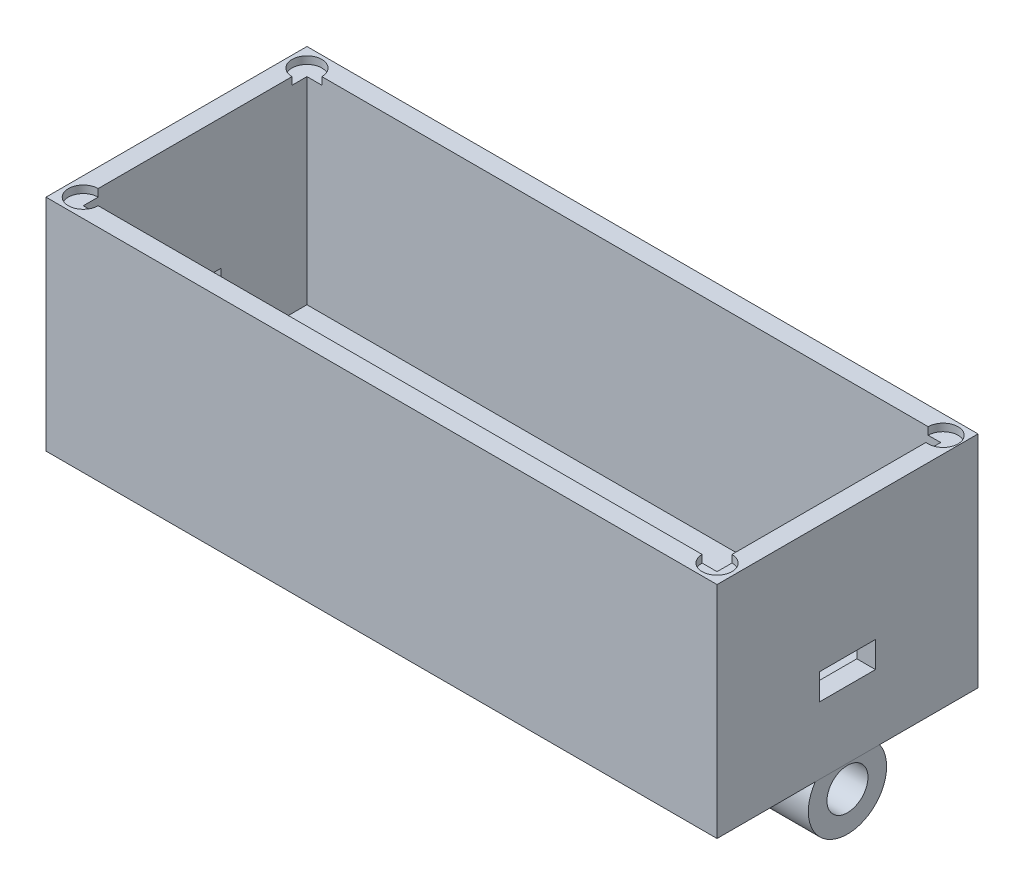
ISO-10303-21;
HEADER;
FILE_DESCRIPTION(('STEP AP214'),'2;1');
FILE_NAME('part.step','',(''),(''),'','','');
FILE_SCHEMA(('AUTOMOTIVE_DESIGN { 1 0 10303 214 1 1 1 1 }'));
ENDSEC;
DATA;
#1=APPLICATION_CONTEXT('core data for automotive mechanical design processes');
#2=APPLICATION_PROTOCOL_DEFINITION('international standard','automotive_design',2000,#1);
#3=PRODUCT_CONTEXT('',#1,'mechanical');
#4=PRODUCT('Part','Part','',(#3));
#5=PRODUCT_RELATED_PRODUCT_CATEGORY('part','',(#4));
#6=PRODUCT_DEFINITION_FORMATION('','',#4);
#7=PRODUCT_DEFINITION_CONTEXT('part definition',#1,'design');
#8=PRODUCT_DEFINITION('design','',#6,#7);
#9=PRODUCT_DEFINITION_SHAPE('','',#8);
#10=(LENGTH_UNIT() NAMED_UNIT(*) SI_UNIT(.MILLI.,.METRE.));
#11=(NAMED_UNIT(*) PLANE_ANGLE_UNIT() SI_UNIT($,.RADIAN.));
#12=(NAMED_UNIT(*) SI_UNIT($,.STERADIAN.) SOLID_ANGLE_UNIT());
#13=UNCERTAINTY_MEASURE_WITH_UNIT(LENGTH_MEASURE(1.E-05),#10,'distance_accuracy_value','');
#14=(GEOMETRIC_REPRESENTATION_CONTEXT(3) GLOBAL_UNCERTAINTY_ASSIGNED_CONTEXT((#13)) GLOBAL_UNIT_ASSIGNED_CONTEXT((#10,
#11,#12)) REPRESENTATION_CONTEXT('',''));
#15=CARTESIAN_POINT('',(0.,0.,0.));
#16=DIRECTION('',(0.,0.,1.));
#17=DIRECTION('',(1.,0.,0.));
#18=AXIS2_PLACEMENT_3D('',#15,#16,#17);
#19=CARTESIAN_POINT('',(180.,0.,0.));
#20=DIRECTION('',(-1.,0.,0.));
#21=DIRECTION('',(0.,0.,1.));
#22=AXIS2_PLACEMENT_3D('',#19,#20,#21);
#23=CYLINDRICAL_SURFACE('',#22,10.5);
#24=CARTESIAN_POINT('',(0.,0.,0.));
#25=DIRECTION('',(1.,0.,0.));
#26=DIRECTION('',(0.,0.,-1.));
#27=AXIS2_PLACEMENT_3D('',#24,#25,#26);
#28=CIRCLE('',#27,10.5);
#29=CARTESIAN_POINT('',(0.,0.,-10.5));
#30=VERTEX_POINT('',#29);
#31=EDGE_CURVE('E336',#30,#30,#28,.T.);
#32=ORIENTED_EDGE('',*,*,#31,.T.);
#33=EDGE_LOOP('',(#32));
#34=FACE_BOUND('',#33,.T.);
#35=DIRECTION('',(-1.,0.,0.));
#36=VECTOR('',#35,1.);
#37=CARTESIAN_POINT('',(180.,6.,8.61684396980704));
#38=LINE('',#37,#36);
#39=CARTESIAN_POINT('',(180.,6.,8.61684396980704));
#40=VERTEX_POINT('',#39);
#41=CARTESIAN_POINT('',(0.0136291881912554,6.,8.61684396980704));
#42=VERTEX_POINT('',#41);
#43=EDGE_CURVE('E354',#40,#42,#38,.T.);
#44=ORIENTED_EDGE('',*,*,#43,.T.);
#45=CARTESIAN_POINT('',(0.0136291881912554,0.,0.));
#46=DIRECTION('',(-1.,0.,0.));
#47=DIRECTION('',(0.,0.,1.));
#48=AXIS2_PLACEMENT_3D('',#45,#46,#47);
#49=CIRCLE('',#48,10.5);
#50=CARTESIAN_POINT('',(0.0136291881912554,6.,-8.61684396980704));
#51=VERTEX_POINT('',#50);
#52=EDGE_CURVE('E347',#42,#51,#49,.T.);
#53=ORIENTED_EDGE('',*,*,#52,.T.);
#54=DIRECTION('',(-1.,0.,0.));
#55=VECTOR('',#54,1.);
#56=CARTESIAN_POINT('',(180.,6.,-8.61684396980704));
#57=LINE('',#56,#55);
#58=CARTESIAN_POINT('',(180.,6.,-8.61684396980704));
#59=VERTEX_POINT('',#58);
#60=EDGE_CURVE('E349',#51,#59,#57,.F.);
#61=ORIENTED_EDGE('',*,*,#60,.T.);
#62=CARTESIAN_POINT('',(180.,0.,0.));
#63=DIRECTION('',(1.,0.,0.));
#64=DIRECTION('',(0.,0.,-1.));
#65=AXIS2_PLACEMENT_3D('',#62,#63,#64);
#66=CIRCLE('',#65,10.5);
#67=EDGE_CURVE('E339',#40,#59,#66,.T.);
#68=ORIENTED_EDGE('',*,*,#67,.F.);
#69=EDGE_LOOP('',(#44,#53,#61,#68));
#70=FACE_BOUND('',#69,.T.);
#71=ADVANCED_FACE('F39',(#34,#70),#23,.T.);
#72=CARTESIAN_POINT('',(180.,0.,0.));
#73=DIRECTION('',(1.,0.,0.));
#74=DIRECTION('',(0.,0.,-1.));
#75=AXIS2_PLACEMENT_3D('',#72,#73,#74);
#76=PLANE('',#75);
#77=DIRECTION('',(0.,0.,-1.));
#78=VECTOR('',#77,1.);
#79=CARTESIAN_POINT('',(180.,6.,0.));
#80=LINE('',#79,#78);
#81=EDGE_CURVE('E324',#40,#59,#80,.T.);
#82=ORIENTED_EDGE('',*,*,#81,.F.);
#83=ORIENTED_EDGE('',*,*,#67,.T.);
#84=EDGE_LOOP('',(#82,#83));
#85=FACE_BOUND('',#84,.T.);
#86=CARTESIAN_POINT('',(180.,0.,0.));
#87=DIRECTION('',(1.,0.,0.));
#88=DIRECTION('',(0.,0.,-1.));
#89=AXIS2_PLACEMENT_3D('',#86,#87,#88);
#90=CIRCLE('',#89,5.5);
#91=CARTESIAN_POINT('',(180.,0.,5.5));
#92=VERTEX_POINT('',#91);
#93=EDGE_CURVE('E333',#92,#92,#90,.T.);
#94=ORIENTED_EDGE('',*,*,#93,.F.);
#95=EDGE_LOOP('',(#94));
#96=FACE_BOUND('',#95,.T.);
#97=ADVANCED_FACE('F480',(#85,#96),#76,.T.);
#98=CARTESIAN_POINT('',(0.,0.,0.));
#99=DIRECTION('',(1.,0.,0.));
#100=DIRECTION('',(0.,0.,-1.));
#101=AXIS2_PLACEMENT_3D('',#98,#99,#100);
#102=PLANE('',#101);
#103=ORIENTED_EDGE('',*,*,#31,.F.);
#104=EDGE_LOOP('',(#103));
#105=FACE_BOUND('',#104,.T.);
#106=CARTESIAN_POINT('',(0.,0.,0.));
#107=DIRECTION('',(1.,0.,0.));
#108=DIRECTION('',(0.,0.,-1.));
#109=AXIS2_PLACEMENT_3D('',#106,#107,#108);
#110=CIRCLE('',#109,5.5);
#111=CARTESIAN_POINT('',(0.,0.,5.5));
#112=VERTEX_POINT('',#111);
#113=EDGE_CURVE('E332',#112,#112,#110,.T.);
#114=ORIENTED_EDGE('',*,*,#113,.T.);
#115=EDGE_LOOP('',(#114));
#116=FACE_BOUND('',#115,.T.);
#117=ADVANCED_FACE('F487',(#105,#116),#102,.F.);
#118=CARTESIAN_POINT('',(180.,0.,0.));
#119=DIRECTION('',(-1.,0.,0.));
#120=DIRECTION('',(0.,0.,1.));
#121=AXIS2_PLACEMENT_3D('',#118,#119,#120);
#122=CYLINDRICAL_SURFACE('',#121,5.5);
#123=CARTESIAN_POINT('',(180.,0.,5.5));
#124=CARTESIAN_POINT('',(178.125,0.,5.5));
#125=CARTESIAN_POINT('',(176.25,0.,5.5));
#126=CARTESIAN_POINT('',(172.5,0.,5.5));
#127=CARTESIAN_POINT('',(170.625,0.,5.5));
#128=CARTESIAN_POINT('',(166.875,0.,5.5));
#129=CARTESIAN_POINT('',(165.,0.,5.5));
#130=CARTESIAN_POINT('',(161.25,0.,5.5));
#131=CARTESIAN_POINT('',(159.375,0.,5.5));
#132=CARTESIAN_POINT('',(155.625,0.,5.5));
#133=CARTESIAN_POINT('',(153.75,0.,5.5));
#134=CARTESIAN_POINT('',(150.,0.,5.5));
#135=CARTESIAN_POINT('',(148.125,0.,5.5));
#136=CARTESIAN_POINT('',(144.375,0.,5.5));
#137=CARTESIAN_POINT('',(142.5,0.,5.5));
#138=CARTESIAN_POINT('',(138.75,0.,5.5));
#139=CARTESIAN_POINT('',(136.875,0.,5.5));
#140=CARTESIAN_POINT('',(133.125,0.,5.5));
#141=CARTESIAN_POINT('',(131.25,0.,5.5));
#142=CARTESIAN_POINT('',(127.5,0.,5.5));
#143=CARTESIAN_POINT('',(125.625,0.,5.5));
#144=CARTESIAN_POINT('',(121.875,0.,5.5));
#145=CARTESIAN_POINT('',(120.,0.,5.5));
#146=CARTESIAN_POINT('',(116.25,0.,5.5));
#147=CARTESIAN_POINT('',(114.375,0.,5.5));
#148=CARTESIAN_POINT('',(110.625,0.,5.5));
#149=CARTESIAN_POINT('',(108.75,0.,5.5));
#150=CARTESIAN_POINT('',(105.,0.,5.5));
#151=CARTESIAN_POINT('',(103.125,0.,5.5));
#152=CARTESIAN_POINT('',(99.375,0.,5.5));
#153=CARTESIAN_POINT('',(97.5,0.,5.5));
#154=CARTESIAN_POINT('',(93.75,0.,5.5));
#155=CARTESIAN_POINT('',(91.875,0.,5.5));
#156=CARTESIAN_POINT('',(88.125,0.,5.5));
#157=CARTESIAN_POINT('',(86.25,0.,5.5));
#158=CARTESIAN_POINT('',(82.5,0.,5.5));
#159=CARTESIAN_POINT('',(80.625,0.,5.5));
#160=CARTESIAN_POINT('',(76.875,0.,5.5));
#161=CARTESIAN_POINT('',(75.,0.,5.5));
#162=CARTESIAN_POINT('',(71.25,0.,5.5));
#163=CARTESIAN_POINT('',(69.375,0.,5.5));
#164=CARTESIAN_POINT('',(65.625,0.,5.5));
#165=CARTESIAN_POINT('',(63.75,0.,5.5));
#166=CARTESIAN_POINT('',(60.,0.,5.5));
#167=CARTESIAN_POINT('',(58.125,0.,5.5));
#168=CARTESIAN_POINT('',(54.375,0.,5.5));
#169=CARTESIAN_POINT('',(52.5,0.,5.5));
#170=CARTESIAN_POINT('',(48.75,0.,5.5));
#171=CARTESIAN_POINT('',(46.875,0.,5.5));
#172=CARTESIAN_POINT('',(43.125,0.,5.5));
#173=CARTESIAN_POINT('',(41.25,0.,5.5));
#174=CARTESIAN_POINT('',(37.5,0.,5.5));
#175=CARTESIAN_POINT('',(35.625,0.,5.5));
#176=CARTESIAN_POINT('',(31.875,0.,5.5));
#177=CARTESIAN_POINT('',(30.,0.,5.5));
#178=CARTESIAN_POINT('',(26.25,0.,5.5));
#179=CARTESIAN_POINT('',(24.375,0.,5.5));
#180=CARTESIAN_POINT('',(20.625,0.,5.5));
#181=CARTESIAN_POINT('',(18.75,0.,5.5));
#182=CARTESIAN_POINT('',(15.,0.,5.5));
#183=CARTESIAN_POINT('',(13.125,0.,5.5));
#184=CARTESIAN_POINT('',(9.37499999999998,0.,5.5));
#185=CARTESIAN_POINT('',(7.49999999999997,0.,5.5));
#186=CARTESIAN_POINT('',(3.74999999999997,0.,5.5));
#187=CARTESIAN_POINT('',(1.87499999999997,0.,5.5));
#188=CARTESIAN_POINT('',(0.,0.,5.5));
#189=B_SPLINE_CURVE_WITH_KNOTS('',3,(#123,#124,#125,#126,#127,#128,#129,#130,#131,#132,#133,
#134,#135,#136,#137,#138,#139,#140,#141,#142,#143,#144,#145,#146,#147,#148,#149,#150,#151,#152,
#153,#154,#155,#156,#157,#158,#159,#160,#161,#162,#163,#164,#165,#166,#167,#168,#169,#170,#171,
#172,#173,#174,#175,#176,#177,#178,#179,#180,#181,#182,#183,#184,#185,#186,#187,#188),
.UNSPECIFIED.,.F.,.F.,(4,2,2,2,2,2,2,2,2,2,2,2,2,2,2,2,2,2,2,2,2,2,2,2,2,2,2,2,2,2,2,2,4),(0.,
5.62500000000002,11.25,16.875,22.5,28.125,33.75,39.375,45.,50.625,56.25,61.875,67.5,73.125,
78.75,84.375,90.,95.625,101.25,106.875,112.5,118.125,123.75,129.375,135.,140.625,146.25,151.875,
157.5,163.125,168.75,174.375,180.),.UNSPECIFIED.);
#190=EDGE_CURVE('BSEAM523',#92,#112,#189,.T.);
#191=ORIENTED_EDGE('',*,*,#93,.T.);
#192=ORIENTED_EDGE('',*,*,#113,.F.);
#193=ORIENTED_EDGE('',*,*,#190,.T.);
#194=ORIENTED_EDGE('',*,*,#190,.F.);
#195=EDGE_LOOP('',(#191,#193,#192,#194));
#196=FACE_BOUND('',#195,.T.);
#197=ADVANCED_FACE('F523',(#196),#122,.F.);
#198=CARTESIAN_POINT('',(0.0136291881912415,6.,35.));
#199=DIRECTION('',(-1.,0.,0.));
#200=DIRECTION('',(0.,0.,1.));
#201=AXIS2_PLACEMENT_3D('',#198,#199,#200);
#202=PLANE('',#201);
#203=DIRECTION('',(0.,1.,0.));
#204=VECTOR('',#203,1.);
#205=CARTESIAN_POINT('',(0.0136291881912415,22.,7.));
#206=LINE('',#205,#204);
#207=CARTESIAN_POINT('',(0.0136291881912415,22.,7.));
#208=VERTEX_POINT('',#207);
#209=CARTESIAN_POINT('',(0.0136291881912415,30.,6.99999999999999));
#210=VERTEX_POINT('',#209);
#211=EDGE_CURVE('E382',#208,#210,#206,.T.);
#212=ORIENTED_EDGE('',*,*,#211,.F.);
#213=DIRECTION('',(0.,0.,1.));
#214=VECTOR('',#213,1.);
#215=CARTESIAN_POINT('',(0.0136291881912415,22.,-7.));
#216=LINE('',#215,#214);
#217=CARTESIAN_POINT('',(0.0136291881912415,22.,-7.));
#218=VERTEX_POINT('',#217);
#219=EDGE_CURVE('E391',#218,#208,#216,.T.);
#220=ORIENTED_EDGE('',*,*,#219,.F.);
#221=DIRECTION('',(0.,-1.,0.));
#222=VECTOR('',#221,1.);
#223=CARTESIAN_POINT('',(0.0136291881912415,22.,-7.));
#224=LINE('',#223,#222);
#225=CARTESIAN_POINT('',(0.0136291881912415,30.,-7.));
#226=VERTEX_POINT('',#225);
#227=EDGE_CURVE('E405',#226,#218,#224,.T.);
#228=ORIENTED_EDGE('',*,*,#227,.F.);
#229=DIRECTION('',(0.,0.,-1.));
#230=VECTOR('',#229,1.);
#231=CARTESIAN_POINT('',(0.0136291881912415,30.,-7.));
#232=LINE('',#231,#230);
#233=EDGE_CURVE('E402',#210,#226,#232,.T.);
#234=ORIENTED_EDGE('',*,*,#233,.F.);
#235=EDGE_LOOP('',(#212,#220,#228,#234));
#236=FACE_BOUND('',#235,.T.);
#237=ORIENTED_EDGE('',*,*,#52,.F.);
#238=DIRECTION('',(0.,0.,1.));
#239=VECTOR('',#238,1.);
#240=CARTESIAN_POINT('',(0.0136291881912415,6.,35.));
#241=LINE('',#240,#239);
#242=CARTESIAN_POINT('',(0.0136291881912415,6.,35.));
#243=VERTEX_POINT('',#242);
#244=EDGE_CURVE('E308',#42,#243,#241,.T.);
#245=ORIENTED_EDGE('',*,*,#244,.T.);
#246=DIRECTION('',(0.,1.,0.));
#247=VECTOR('',#246,1.);
#248=CARTESIAN_POINT('',(0.0136291881912415,6.,35.));
#249=LINE('',#248,#247);
#250=CARTESIAN_POINT('',(0.0136291881912502,65.,35.));
#251=VERTEX_POINT('',#250);
#252=EDGE_CURVE('E321',#243,#251,#249,.T.);
#253=ORIENTED_EDGE('',*,*,#252,.T.);
#254=DIRECTION('',(0.,0.,1.));
#255=VECTOR('',#254,1.);
#256=CARTESIAN_POINT('',(0.0136291881912415,65.,-35.));
#257=LINE('',#256,#255);
#258=CARTESIAN_POINT('',(0.0136291881912415,65.,-35.));
#259=VERTEX_POINT('',#258);
#260=EDGE_CURVE('E290',#259,#251,#257,.T.);
#261=ORIENTED_EDGE('',*,*,#260,.F.);
#262=DIRECTION('',(0.,1.,0.));
#263=VECTOR('',#262,1.);
#264=CARTESIAN_POINT('',(0.0136291881912415,6.,-35.));
#265=LINE('',#264,#263);
#266=CARTESIAN_POINT('',(0.0136291881912415,6.,-35.));
#267=VERTEX_POINT('',#266);
#268=EDGE_CURVE('E322',#267,#259,#265,.T.);
#269=ORIENTED_EDGE('',*,*,#268,.F.);
#270=EDGE_CURVE('E309',#267,#51,#241,.T.);
#271=ORIENTED_EDGE('',*,*,#270,.T.);
#272=EDGE_LOOP('',(#237,#245,#253,#261,#269,#271));
#273=FACE_BOUND('',#272,.T.);
#274=ADVANCED_FACE('F502',(#236,#273),#202,.T.);
#275=CARTESIAN_POINT('',(0.,6.,0.));
#276=DIRECTION('',(0.,-1.,0.));
#277=DIRECTION('',(0.,0.,-1.));
#278=AXIS2_PLACEMENT_3D('',#275,#276,#277);
#279=PLANE('',#278);
#280=ORIENTED_EDGE('',*,*,#43,.F.);
#281=ORIENTED_EDGE('',*,*,#81,.T.);
#282=ORIENTED_EDGE('',*,*,#60,.F.);
#283=ORIENTED_EDGE('',*,*,#270,.F.);
#284=DIRECTION('',(-1.,0.,0.));
#285=VECTOR('',#284,1.);
#286=CARTESIAN_POINT('',(0.0136291881912415,6.,-35.));
#287=LINE('',#286,#285);
#288=CARTESIAN_POINT('',(180.013629188191,6.,-35.));
#289=VERTEX_POINT('',#288);
#290=EDGE_CURVE('E318',#289,#267,#287,.T.);
#291=ORIENTED_EDGE('',*,*,#290,.F.);
#292=DIRECTION('',(0.,0.,-1.));
#293=VECTOR('',#292,1.);
#294=CARTESIAN_POINT('',(180.013629188191,6.,35.));
#295=LINE('',#294,#293);
#296=CARTESIAN_POINT('',(180.013629188191,6.,35.));
#297=VERTEX_POINT('',#296);
#298=EDGE_CURVE('E315',#297,#289,#295,.T.);
#299=ORIENTED_EDGE('',*,*,#298,.F.);
#300=DIRECTION('',(1.,0.,0.));
#301=VECTOR('',#300,1.);
#302=CARTESIAN_POINT('',(0.0136291881912415,6.,35.));
#303=LINE('',#302,#301);
#304=EDGE_CURVE('E312',#243,#297,#303,.T.);
#305=ORIENTED_EDGE('',*,*,#304,.F.);
#306=ORIENTED_EDGE('',*,*,#244,.F.);
#307=EDGE_LOOP('',(#280,#281,#282,#283,#291,#299,#305,#306));
#308=FACE_BOUND('',#307,.T.);
#309=ADVANCED_FACE('F498',(#308),#279,.T.);
#310=CARTESIAN_POINT('',(0.0136291881912415,6.,-35.));
#311=DIRECTION('',(0.,0.,-1.));
#312=DIRECTION('',(-1.,0.,0.));
#313=AXIS2_PLACEMENT_3D('',#310,#311,#312);
#314=PLANE('',#313);
#315=ORIENTED_EDGE('',*,*,#268,.T.);
#316=DIRECTION('',(-1.,0.,0.));
#317=VECTOR('',#316,1.);
#318=CARTESIAN_POINT('',(0.0136291881912415,65.,-35.));
#319=LINE('',#318,#317);
#320=CARTESIAN_POINT('',(180.013629188191,65.,-35.));
#321=VERTEX_POINT('',#320);
#322=EDGE_CURVE('E299',#321,#259,#319,.T.);
#323=ORIENTED_EDGE('',*,*,#322,.F.);
#324=DIRECTION('',(0.,1.,0.));
#325=VECTOR('',#324,1.);
#326=CARTESIAN_POINT('',(180.013629188191,6.,-35.));
#327=LINE('',#326,#325);
#328=EDGE_CURVE('E325',#289,#321,#327,.T.);
#329=ORIENTED_EDGE('',*,*,#328,.F.);
#330=ORIENTED_EDGE('',*,*,#290,.T.);
#331=EDGE_LOOP('',(#315,#323,#329,#330));
#332=FACE_BOUND('',#331,.T.);
#333=ADVANCED_FACE('F512',(#332),#314,.T.);
#334=CARTESIAN_POINT('',(180.013629188191,6.,35.));
#335=DIRECTION('',(1.,0.,0.));
#336=DIRECTION('',(0.,0.,-1.));
#337=AXIS2_PLACEMENT_3D('',#334,#335,#336);
#338=PLANE('',#337);
#339=DIRECTION('',(0.,1.,0.));
#340=VECTOR('',#339,1.);
#341=CARTESIAN_POINT('',(180.013629188191,24.,-7.5));
#342=LINE('',#341,#340);
#343=CARTESIAN_POINT('',(180.013629188191,24.,-7.5));
#344=VERTEX_POINT('',#343);
#345=CARTESIAN_POINT('',(180.013629188191,31.,-7.5));
#346=VERTEX_POINT('',#345);
#347=EDGE_CURVE('E412',#344,#346,#342,.T.);
#348=ORIENTED_EDGE('',*,*,#347,.F.);
#349=DIRECTION('',(0.,0.,-1.));
#350=VECTOR('',#349,1.);
#351=CARTESIAN_POINT('',(180.013629188191,24.,7.5));
#352=LINE('',#351,#350);
#353=CARTESIAN_POINT('',(180.013629188191,24.,7.5));
#354=VERTEX_POINT('',#353);
#355=EDGE_CURVE('E423',#354,#344,#352,.T.);
#356=ORIENTED_EDGE('',*,*,#355,.F.);
#357=DIRECTION('',(0.,-1.,0.));
#358=VECTOR('',#357,1.);
#359=CARTESIAN_POINT('',(180.013629188191,24.,7.5));
#360=LINE('',#359,#358);
#361=CARTESIAN_POINT('',(180.013629188191,31.,7.5));
#362=VERTEX_POINT('',#361);
#363=EDGE_CURVE('E436',#362,#354,#360,.T.);
#364=ORIENTED_EDGE('',*,*,#363,.F.);
#365=DIRECTION('',(0.,0.,1.));
#366=VECTOR('',#365,1.);
#367=CARTESIAN_POINT('',(180.013629188191,31.,7.5));
#368=LINE('',#367,#366);
#369=EDGE_CURVE('E433',#346,#362,#368,.T.);
#370=ORIENTED_EDGE('',*,*,#369,.F.);
#371=EDGE_LOOP('',(#348,#356,#364,#370));
#372=FACE_BOUND('',#371,.T.);
#373=ORIENTED_EDGE('',*,*,#328,.T.);
#374=DIRECTION('',(0.,0.,-1.));
#375=VECTOR('',#374,1.);
#376=CARTESIAN_POINT('',(180.013629188191,65.,-35.));
#377=LINE('',#376,#375);
#378=CARTESIAN_POINT('',(180.013629188191,65.,35.));
#379=VERTEX_POINT('',#378);
#380=EDGE_CURVE('E296',#379,#321,#377,.T.);
#381=ORIENTED_EDGE('',*,*,#380,.F.);
#382=DIRECTION('',(0.,1.,0.));
#383=VECTOR('',#382,1.);
#384=CARTESIAN_POINT('',(180.013629188191,6.,35.));
#385=LINE('',#384,#383);
#386=EDGE_CURVE('E327',#297,#379,#385,.T.);
#387=ORIENTED_EDGE('',*,*,#386,.F.);
#388=ORIENTED_EDGE('',*,*,#298,.T.);
#389=EDGE_LOOP('',(#373,#381,#387,#388));
#390=FACE_BOUND('',#389,.T.);
#391=ADVANCED_FACE('F457',(#372,#390),#338,.T.);
#392=CARTESIAN_POINT('',(0.0136291881912415,6.,35.));
#393=DIRECTION('',(0.,0.,1.));
#394=DIRECTION('',(1.,0.,0.));
#395=AXIS2_PLACEMENT_3D('',#392,#393,#394);
#396=PLANE('',#395);
#397=ORIENTED_EDGE('',*,*,#386,.T.);
#398=DIRECTION('',(1.,0.,0.));
#399=VECTOR('',#398,1.);
#400=CARTESIAN_POINT('',(0.0136291881912502,65.,35.));
#401=LINE('',#400,#399);
#402=EDGE_CURVE('E293',#251,#379,#401,.T.);
#403=ORIENTED_EDGE('',*,*,#402,.F.);
#404=ORIENTED_EDGE('',*,*,#252,.F.);
#405=ORIENTED_EDGE('',*,*,#304,.T.);
#406=EDGE_LOOP('',(#397,#403,#404,#405));
#407=FACE_BOUND('',#406,.T.);
#408=ADVANCED_FACE('F506',(#407),#396,.T.);
#409=CARTESIAN_POINT('',(5.01362918819124,65.,-30.));
#410=DIRECTION('',(1.,0.,0.));
#411=DIRECTION('',(0.,0.,-1.));
#412=AXIS2_PLACEMENT_3D('',#409,#410,#411);
#413=PLANE('',#412);
#414=DIRECTION('',(0.,1.,0.));
#415=VECTOR('',#414,1.);
#416=CARTESIAN_POINT('',(5.01362918819124,63.,26.));
#417=LINE('',#416,#415);
#418=CARTESIAN_POINT('',(5.01362918819124,63.,26.));
#419=VERTEX_POINT('',#418);
#420=CARTESIAN_POINT('',(5.01362918819124,65.,26.));
#421=VERTEX_POINT('',#420);
#422=EDGE_CURVE('E379',#419,#421,#417,.T.);
#423=ORIENTED_EDGE('',*,*,#422,.F.);
#424=DIRECTION('',(0.,0.,1.));
#425=VECTOR('',#424,1.);
#426=CARTESIAN_POINT('',(5.01362918819124,63.,-30.));
#427=LINE('',#426,#425);
#428=CARTESIAN_POINT('',(5.01362918819124,63.,30.));
#429=VERTEX_POINT('',#428);
#430=EDGE_CURVE('E378',#419,#429,#427,.T.);
#431=ORIENTED_EDGE('',*,*,#430,.T.);
#432=DIRECTION('',(0.,-1.,0.));
#433=VECTOR('',#432,1.);
#434=CARTESIAN_POINT('',(5.01362918819124,65.,30.));
#435=LINE('',#434,#433);
#436=CARTESIAN_POINT('',(5.01362918819124,10.,30.));
#437=VERTEX_POINT('',#436);
#438=EDGE_CURVE('E288',#429,#437,#435,.T.);
#439=ORIENTED_EDGE('',*,*,#438,.T.);
#440=DIRECTION('',(0.,0.,1.));
#441=VECTOR('',#440,1.);
#442=CARTESIAN_POINT('',(5.01362918819124,10.,-30.));
#443=LINE('',#442,#441);
#444=CARTESIAN_POINT('',(5.01362918819124,10.,3.20156211871641));
#445=VERTEX_POINT('',#444);
#446=EDGE_CURVE('E277',#445,#437,#443,.T.);
#447=ORIENTED_EDGE('',*,*,#446,.F.);
#448=CARTESIAN_POINT('',(5.01362918819123,0.,0.));
#449=DIRECTION('',(1.,0.,0.));
#450=DIRECTION('',(0.,0.,-1.));
#451=AXIS2_PLACEMENT_3D('',#448,#449,#450);
#452=CIRCLE('',#451,10.5);
#453=CARTESIAN_POINT('',(5.01362918819124,10.,-3.20156211871643));
#454=VERTEX_POINT('',#453);
#455=EDGE_CURVE('E305',#454,#445,#452,.T.);
#456=ORIENTED_EDGE('',*,*,#455,.F.);
#457=CARTESIAN_POINT('',(5.01362918819124,10.,-30.));
#458=VERTEX_POINT('',#457);
#459=EDGE_CURVE('E273',#458,#454,#443,.T.);
#460=ORIENTED_EDGE('',*,*,#459,.F.);
#461=DIRECTION('',(0.,-1.,0.));
#462=VECTOR('',#461,1.);
#463=CARTESIAN_POINT('',(5.01362918819124,65.,-30.));
#464=LINE('',#463,#462);
#465=CARTESIAN_POINT('',(5.01362918819124,63.,-30.));
#466=VERTEX_POINT('',#465);
#467=EDGE_CURVE('E272',#466,#458,#464,.T.);
#468=ORIENTED_EDGE('',*,*,#467,.F.);
#469=DIRECTION('',(0.,0.,1.));
#470=VECTOR('',#469,1.);
#471=CARTESIAN_POINT('',(5.01362918819124,63.,-30.));
#472=LINE('',#471,#470);
#473=CARTESIAN_POINT('',(5.01362918819124,63.,-26.));
#474=VERTEX_POINT('',#473);
#475=EDGE_CURVE('E246',#466,#474,#472,.T.);
#476=ORIENTED_EDGE('',*,*,#475,.T.);
#477=DIRECTION('',(0.,1.,0.));
#478=VECTOR('',#477,1.);
#479=CARTESIAN_POINT('',(5.01362918819124,63.,-26.));
#480=LINE('',#479,#478);
#481=CARTESIAN_POINT('',(5.01362918819124,65.,-26.));
#482=VERTEX_POINT('',#481);
#483=EDGE_CURVE('E227',#482,#474,#480,.F.);
#484=ORIENTED_EDGE('',*,*,#483,.F.);
#485=DIRECTION('',(0.,0.,1.));
#486=VECTOR('',#485,1.);
#487=CARTESIAN_POINT('',(5.01362918819124,65.,-30.));
#488=LINE('',#487,#486);
#489=EDGE_CURVE('E244',#482,#421,#488,.T.);
#490=ORIENTED_EDGE('',*,*,#489,.T.);
#491=EDGE_LOOP('',(#423,#431,#439,#447,#456,#460,#468,#476,#484,#490));
#492=FACE_BOUND('',#491,.T.);
#493=DIRECTION('',(0.,1.,0.));
#494=VECTOR('',#493,1.);
#495=CARTESIAN_POINT('',(5.01362918819124,22.,7.));
#496=LINE('',#495,#494);
#497=CARTESIAN_POINT('',(5.01362918819124,22.,7.));
#498=VERTEX_POINT('',#497);
#499=CARTESIAN_POINT('',(5.01362918819124,30.,7.));
#500=VERTEX_POINT('',#499);
#501=EDGE_CURVE('E387',#498,#500,#496,.T.);
#502=ORIENTED_EDGE('',*,*,#501,.T.);
#503=DIRECTION('',(0.,0.,-1.));
#504=VECTOR('',#503,1.);
#505=CARTESIAN_POINT('',(5.01362918819124,30.,-7.));
#506=LINE('',#505,#504);
#507=CARTESIAN_POINT('',(5.01362918819124,30.,-7.));
#508=VERTEX_POINT('',#507);
#509=EDGE_CURVE('E390',#500,#508,#506,.T.);
#510=ORIENTED_EDGE('',*,*,#509,.T.);
#511=DIRECTION('',(0.,-1.,0.));
#512=VECTOR('',#511,1.);
#513=CARTESIAN_POINT('',(5.01362918819124,22.,-7.));
#514=LINE('',#513,#512);
#515=CARTESIAN_POINT('',(5.01362918819124,22.,-7.));
#516=VERTEX_POINT('',#515);
#517=EDGE_CURVE('E394',#508,#516,#514,.T.);
#518=ORIENTED_EDGE('',*,*,#517,.T.);
#519=DIRECTION('',(0.,0.,1.));
#520=VECTOR('',#519,1.);
#521=CARTESIAN_POINT('',(5.01362918819124,22.,-7.));
#522=LINE('',#521,#520);
#523=EDGE_CURVE('E397',#516,#498,#522,.T.);
#524=ORIENTED_EDGE('',*,*,#523,.T.);
#525=EDGE_LOOP('',(#502,#510,#518,#524));
#526=FACE_BOUND('',#525,.T.);
#527=ADVANCED_FACE('F242',(#492,#526),#413,.T.);
#528=CARTESIAN_POINT('',(175.013629188191,65.,30.));
#529=DIRECTION('',(-1.,0.,0.));
#530=DIRECTION('',(0.,0.,1.));
#531=AXIS2_PLACEMENT_3D('',#528,#529,#530);
#532=PLANE('',#531);
#533=DIRECTION('',(0.,1.,0.));
#534=VECTOR('',#533,1.);
#535=CARTESIAN_POINT('',(175.013629188191,63.,-26.0519687067217));
#536=LINE('',#535,#534);
#537=CARTESIAN_POINT('',(175.013629188191,63.,-26.0519687067217));
#538=VERTEX_POINT('',#537);
#539=CARTESIAN_POINT('',(175.013629188191,65.,-26.0519687067217));
#540=VERTEX_POINT('',#539);
#541=EDGE_CURVE('E800',#538,#540,#536,.T.);
#542=ORIENTED_EDGE('',*,*,#541,.F.);
#543=DIRECTION('',(0.,0.,-1.));
#544=VECTOR('',#543,1.);
#545=CARTESIAN_POINT('',(175.013629188191,63.,30.));
#546=LINE('',#545,#544);
#547=CARTESIAN_POINT('',(175.013629188191,63.,-30.));
#548=VERTEX_POINT('',#547);
#549=EDGE_CURVE('E247',#538,#548,#546,.T.);
#550=ORIENTED_EDGE('',*,*,#549,.T.);
#551=DIRECTION('',(0.,-1.,0.));
#552=VECTOR('',#551,1.);
#553=CARTESIAN_POINT('',(175.013629188191,65.,-30.));
#554=LINE('',#553,#552);
#555=CARTESIAN_POINT('',(175.013629188191,10.,-30.));
#556=VERTEX_POINT('',#555);
#557=EDGE_CURVE('E284',#548,#556,#554,.T.);
#558=ORIENTED_EDGE('',*,*,#557,.T.);
#559=DIRECTION('',(0.,0.,-1.));
#560=VECTOR('',#559,1.);
#561=CARTESIAN_POINT('',(175.013629188191,10.,30.));
#562=LINE('',#561,#560);
#563=CARTESIAN_POINT('',(175.013629188191,10.,-3.20156211871641));
#564=VERTEX_POINT('',#563);
#565=EDGE_CURVE('E280',#564,#556,#562,.T.);
#566=ORIENTED_EDGE('',*,*,#565,.F.);
#567=CARTESIAN_POINT('',(175.013629188191,0.,0.));
#568=DIRECTION('',(-1.,0.,0.));
#569=DIRECTION('',(0.,0.,1.));
#570=AXIS2_PLACEMENT_3D('',#567,#568,#569);
#571=CIRCLE('',#570,10.5);
#572=CARTESIAN_POINT('',(175.013629188191,10.,3.20156211871643));
#573=VERTEX_POINT('',#572);
#574=EDGE_CURVE('E302',#573,#564,#571,.T.);
#575=ORIENTED_EDGE('',*,*,#574,.F.);
#576=CARTESIAN_POINT('',(175.013629188191,10.,30.));
#577=VERTEX_POINT('',#576);
#578=EDGE_CURVE('E262',#577,#573,#562,.T.);
#579=ORIENTED_EDGE('',*,*,#578,.F.);
#580=DIRECTION('',(0.,-1.,0.));
#581=VECTOR('',#580,1.);
#582=CARTESIAN_POINT('',(175.013629188191,65.,30.));
#583=LINE('',#582,#581);
#584=CARTESIAN_POINT('',(175.013629188191,63.,30.));
#585=VERTEX_POINT('',#584);
#586=EDGE_CURVE('E286',#585,#577,#583,.T.);
#587=ORIENTED_EDGE('',*,*,#586,.F.);
#588=DIRECTION('',(0.,0.,-1.));
#589=VECTOR('',#588,1.);
#590=CARTESIAN_POINT('',(175.013629188191,63.,30.));
#591=LINE('',#590,#589);
#592=CARTESIAN_POINT('',(175.013629188191,63.,26.));
#593=VERTEX_POINT('',#592);
#594=EDGE_CURVE('E61',#585,#593,#591,.T.);
#595=ORIENTED_EDGE('',*,*,#594,.T.);
#596=DIRECTION('',(0.,1.,0.));
#597=VECTOR('',#596,1.);
#598=CARTESIAN_POINT('',(175.013629188191,63.,26.));
#599=LINE('',#598,#597);
#600=CARTESIAN_POINT('',(175.013629188191,65.,26.));
#601=VERTEX_POINT('',#600);
#602=EDGE_CURVE('E380',#601,#593,#599,.F.);
#603=ORIENTED_EDGE('',*,*,#602,.F.);
#604=DIRECTION('',(0.,0.,-1.));
#605=VECTOR('',#604,1.);
#606=CARTESIAN_POINT('',(175.013629188191,65.,30.));
#607=LINE('',#606,#605);
#608=EDGE_CURVE('E259',#601,#540,#607,.T.);
#609=ORIENTED_EDGE('',*,*,#608,.T.);
#610=EDGE_LOOP('',(#542,#550,#558,#566,#575,#579,#587,#595,#603,#609));
#611=FACE_BOUND('',#610,.T.);
#612=DIRECTION('',(0.,1.,0.));
#613=VECTOR('',#612,1.);
#614=CARTESIAN_POINT('',(175.013629188191,24.,-7.5));
#615=LINE('',#614,#613);
#616=CARTESIAN_POINT('',(175.013629188191,24.,-7.5));
#617=VERTEX_POINT('',#616);
#618=CARTESIAN_POINT('',(175.013629188191,31.,-7.5));
#619=VERTEX_POINT('',#618);
#620=EDGE_CURVE('E419',#617,#619,#615,.T.);
#621=ORIENTED_EDGE('',*,*,#620,.T.);
#622=DIRECTION('',(0.,0.,1.));
#623=VECTOR('',#622,1.);
#624=CARTESIAN_POINT('',(175.013629188191,31.,7.5));
#625=LINE('',#624,#623);
#626=CARTESIAN_POINT('',(175.013629188191,31.,7.5));
#627=VERTEX_POINT('',#626);
#628=EDGE_CURVE('E422',#619,#627,#625,.T.);
#629=ORIENTED_EDGE('',*,*,#628,.T.);
#630=DIRECTION('',(0.,-1.,0.));
#631=VECTOR('',#630,1.);
#632=CARTESIAN_POINT('',(175.013629188191,24.,7.5));
#633=LINE('',#632,#631);
#634=CARTESIAN_POINT('',(175.013629188191,24.,7.5));
#635=VERTEX_POINT('',#634);
#636=EDGE_CURVE('E426',#627,#635,#633,.T.);
#637=ORIENTED_EDGE('',*,*,#636,.T.);
#638=DIRECTION('',(0.,0.,-1.));
#639=VECTOR('',#638,1.);
#640=CARTESIAN_POINT('',(175.013629188191,24.,7.5));
#641=LINE('',#640,#639);
#642=EDGE_CURVE('E429',#635,#617,#641,.T.);
#643=ORIENTED_EDGE('',*,*,#642,.T.);
#644=EDGE_LOOP('',(#621,#629,#637,#643));
#645=FACE_BOUND('',#644,.T.);
#646=ADVANCED_FACE('F465',(#611,#645),#532,.T.);
#647=CARTESIAN_POINT('',(0.,65.,0.));
#648=DIRECTION('',(0.,1.,0.));
#649=DIRECTION('',(0.,0.,1.));
#650=AXIS2_PLACEMENT_3D('',#647,#648,#649);
#651=PLANE('',#650);
#652=CARTESIAN_POINT('',(175.65631799881,65.,-30.));
#653=DIRECTION('',(0.,1.,0.));
#654=DIRECTION('',(0.,0.,1.));
#655=AXIS2_PLACEMENT_3D('',#652,#653,#654);
#656=CIRCLE('',#655,3.99999999999999);
#657=CARTESIAN_POINT('',(171.65631799881,65.,-30.));
#658=VERTEX_POINT('',#657);
#659=EDGE_CURVE('E236',#540,#658,#656,.T.);
#660=ORIENTED_EDGE('',*,*,#659,.F.);
#661=ORIENTED_EDGE('',*,*,#608,.F.);
#662=CARTESIAN_POINT('',(175.013629188191,65.,30.));
#663=DIRECTION('',(0.,1.,0.));
#664=DIRECTION('',(0.,0.,1.));
#665=AXIS2_PLACEMENT_3D('',#662,#663,#664);
#666=CIRCLE('',#665,3.99999999999999);
#667=CARTESIAN_POINT('',(171.013629188191,65.,30.));
#668=VERTEX_POINT('',#667);
#669=EDGE_CURVE('E788',#668,#601,#666,.T.);
#670=ORIENTED_EDGE('',*,*,#669,.F.);
#671=DIRECTION('',(1.,0.,0.));
#672=VECTOR('',#671,1.);
#673=CARTESIAN_POINT('',(5.01362918819124,65.,30.));
#674=LINE('',#673,#672);
#675=CARTESIAN_POINT('',(9.01362918819125,65.,30.));
#676=VERTEX_POINT('',#675);
#677=EDGE_CURVE('E255',#676,#668,#674,.T.);
#678=ORIENTED_EDGE('',*,*,#677,.F.);
#679=CARTESIAN_POINT('',(5.01362918819124,65.,30.));
#680=DIRECTION('',(0.,1.,0.));
#681=DIRECTION('',(0.,0.,1.));
#682=AXIS2_PLACEMENT_3D('',#679,#680,#681);
#683=CIRCLE('',#682,4.);
#684=EDGE_CURVE('E254',#421,#676,#683,.T.);
#685=ORIENTED_EDGE('',*,*,#684,.F.);
#686=ORIENTED_EDGE('',*,*,#489,.F.);
#687=CARTESIAN_POINT('',(5.01362918819124,65.,-30.));
#688=DIRECTION('',(0.,1.,0.));
#689=DIRECTION('',(0.,0.,1.));
#690=AXIS2_PLACEMENT_3D('',#687,#688,#689);
#691=CIRCLE('',#690,4.);
#692=CARTESIAN_POINT('',(9.01362918819125,65.,-30.));
#693=VERTEX_POINT('',#692);
#694=EDGE_CURVE('E223',#693,#482,#691,.T.);
#695=ORIENTED_EDGE('',*,*,#694,.F.);
#696=DIRECTION('',(-1.,0.,0.));
#697=VECTOR('',#696,1.);
#698=CARTESIAN_POINT('',(175.013629188191,65.,-30.));
#699=LINE('',#698,#697);
#700=EDGE_CURVE('E270',#658,#693,#699,.T.);
#701=ORIENTED_EDGE('',*,*,#700,.F.);
#702=EDGE_LOOP('',(#660,#661,#670,#678,#685,#686,#695,#701));
#703=FACE_BOUND('',#702,.T.);
#704=ORIENTED_EDGE('',*,*,#260,.T.);
#705=ORIENTED_EDGE('',*,*,#402,.T.);
#706=ORIENTED_EDGE('',*,*,#380,.T.);
#707=ORIENTED_EDGE('',*,*,#322,.T.);
#708=EDGE_LOOP('',(#704,#705,#706,#707));
#709=FACE_BOUND('',#708,.T.);
#710=ADVANCED_FACE('F251',(#703,#709),#651,.T.);
#711=CARTESIAN_POINT('',(5.01362918819124,65.,30.));
#712=DIRECTION('',(0.,0.,-1.));
#713=DIRECTION('',(-1.,0.,0.));
#714=AXIS2_PLACEMENT_3D('',#711,#712,#713);
#715=PLANE('',#714);
#716=DIRECTION('',(0.,1.,0.));
#717=VECTOR('',#716,1.);
#718=CARTESIAN_POINT('',(9.01362918819125,63.,30.));
#719=LINE('',#718,#717);
#720=CARTESIAN_POINT('',(9.01362918819125,63.,30.));
#721=VERTEX_POINT('',#720);
#722=EDGE_CURVE('E11',#676,#721,#719,.F.);
#723=ORIENTED_EDGE('',*,*,#722,.F.);
#724=ORIENTED_EDGE('',*,*,#677,.T.);
#725=DIRECTION('',(0.,1.,0.));
#726=VECTOR('',#725,1.);
#727=CARTESIAN_POINT('',(171.013629188191,63.,30.));
#728=LINE('',#727,#726);
#729=CARTESIAN_POINT('',(171.013629188191,63.,30.));
#730=VERTEX_POINT('',#729);
#731=EDGE_CURVE('E369',#730,#668,#728,.T.);
#732=ORIENTED_EDGE('',*,*,#731,.F.);
#733=DIRECTION('',(1.,0.,0.));
#734=VECTOR('',#733,1.);
#735=CARTESIAN_POINT('',(5.01362918819124,63.,30.));
#736=LINE('',#735,#734);
#737=EDGE_CURVE('E367',#730,#585,#736,.T.);
#738=ORIENTED_EDGE('',*,*,#737,.T.);
#739=ORIENTED_EDGE('',*,*,#586,.T.);
#740=DIRECTION('',(1.,0.,0.));
#741=VECTOR('',#740,1.);
#742=CARTESIAN_POINT('',(5.01362918819124,10.,30.));
#743=LINE('',#742,#741);
#744=EDGE_CURVE('E276',#437,#577,#743,.T.);
#745=ORIENTED_EDGE('',*,*,#744,.F.);
#746=ORIENTED_EDGE('',*,*,#438,.F.);
#747=DIRECTION('',(1.,0.,0.));
#748=VECTOR('',#747,1.);
#749=CARTESIAN_POINT('',(5.01362918819124,63.,30.));
#750=LINE('',#749,#748);
#751=EDGE_CURVE('E47',#429,#721,#750,.T.);
#752=ORIENTED_EDGE('',*,*,#751,.T.);
#753=EDGE_LOOP('',(#723,#724,#732,#738,#739,#745,#746,#752));
#754=FACE_BOUND('',#753,.T.);
#755=ADVANCED_FACE('F374',(#754),#715,.T.);
#756=CARTESIAN_POINT('',(175.013629188191,65.,-30.));
#757=DIRECTION('',(0.,0.,1.));
#758=DIRECTION('',(1.,0.,0.));
#759=AXIS2_PLACEMENT_3D('',#756,#757,#758);
#760=PLANE('',#759);
#761=DIRECTION('',(0.,1.,0.));
#762=VECTOR('',#761,1.);
#763=CARTESIAN_POINT('',(171.65631799881,63.,-30.));
#764=LINE('',#763,#762);
#765=CARTESIAN_POINT('',(171.65631799881,63.,-30.));
#766=VERTEX_POINT('',#765);
#767=EDGE_CURVE('E364',#658,#766,#764,.F.);
#768=ORIENTED_EDGE('',*,*,#767,.F.);
#769=ORIENTED_EDGE('',*,*,#700,.T.);
#770=DIRECTION('',(0.,1.,0.));
#771=VECTOR('',#770,1.);
#772=CARTESIAN_POINT('',(9.01362918819125,63.,-30.));
#773=LINE('',#772,#771);
#774=CARTESIAN_POINT('',(9.01362918819125,63.,-30.));
#775=VERTEX_POINT('',#774);
#776=EDGE_CURVE('E230',#775,#693,#773,.T.);
#777=ORIENTED_EDGE('',*,*,#776,.F.);
#778=DIRECTION('',(-1.,0.,0.));
#779=VECTOR('',#778,1.);
#780=CARTESIAN_POINT('',(175.013629188191,63.,-30.));
#781=LINE('',#780,#779);
#782=EDGE_CURVE('E357',#775,#466,#781,.T.);
#783=ORIENTED_EDGE('',*,*,#782,.T.);
#784=ORIENTED_EDGE('',*,*,#467,.T.);
#785=DIRECTION('',(-1.,0.,0.));
#786=VECTOR('',#785,1.);
#787=CARTESIAN_POINT('',(175.013629188191,10.,-30.));
#788=LINE('',#787,#786);
#789=EDGE_CURVE('E256',#556,#458,#788,.T.);
#790=ORIENTED_EDGE('',*,*,#789,.F.);
#791=ORIENTED_EDGE('',*,*,#557,.F.);
#792=DIRECTION('',(-1.,0.,0.));
#793=VECTOR('',#792,1.);
#794=CARTESIAN_POINT('',(175.013629188191,63.,-30.));
#795=LINE('',#794,#793);
#796=EDGE_CURVE('E361',#548,#766,#795,.T.);
#797=ORIENTED_EDGE('',*,*,#796,.T.);
#798=EDGE_LOOP('',(#768,#769,#777,#783,#784,#790,#791,#797));
#799=FACE_BOUND('',#798,.T.);
#800=ADVANCED_FACE('F598',(#799),#760,.T.);
#801=CARTESIAN_POINT('',(0.,10.,0.));
#802=DIRECTION('',(0.,-1.,0.));
#803=DIRECTION('',(0.,0.,-1.));
#804=AXIS2_PLACEMENT_3D('',#801,#802,#803);
#805=PLANE('',#804);
#806=DIRECTION('',(-1.,0.,0.));
#807=VECTOR('',#806,1.);
#808=CARTESIAN_POINT('',(180.,10.,3.20156211871642));
#809=LINE('',#808,#807);
#810=EDGE_CURVE('E351',#573,#445,#809,.T.);
#811=ORIENTED_EDGE('',*,*,#810,.T.);
#812=ORIENTED_EDGE('',*,*,#446,.T.);
#813=ORIENTED_EDGE('',*,*,#744,.T.);
#814=ORIENTED_EDGE('',*,*,#578,.T.);
#815=EDGE_LOOP('',(#811,#812,#813,#814));
#816=FACE_BOUND('',#815,.T.);
#817=ADVANCED_FACE('F566',(#816),#805,.F.);
#818=ORIENTED_EDGE('',*,*,#789,.T.);
#819=ORIENTED_EDGE('',*,*,#459,.T.);
#820=DIRECTION('',(-1.,0.,0.));
#821=VECTOR('',#820,1.);
#822=CARTESIAN_POINT('',(180.,10.,-3.20156211871642));
#823=LINE('',#822,#821);
#824=EDGE_CURVE('E342',#454,#564,#823,.F.);
#825=ORIENTED_EDGE('',*,*,#824,.T.);
#826=ORIENTED_EDGE('',*,*,#565,.T.);
#827=EDGE_LOOP('',(#818,#819,#825,#826));
#828=FACE_BOUND('',#827,.T.);
#829=ADVANCED_FACE('F475',(#828),#805,.F.);
#830=ORIENTED_EDGE('',*,*,#824,.F.);
#831=ORIENTED_EDGE('',*,*,#455,.T.);
#832=ORIENTED_EDGE('',*,*,#810,.F.);
#833=ORIENTED_EDGE('',*,*,#574,.T.);
#834=EDGE_LOOP('',(#830,#831,#832,#833));
#835=FACE_BOUND('',#834,.T.);
#836=ADVANCED_FACE('F41',(#835),#23,.T.);
#837=CARTESIAN_POINT('',(175.013629188191,24.,-7.5));
#838=DIRECTION('',(0.,0.,-1.));
#839=DIRECTION('',(-1.,0.,0.));
#840=AXIS2_PLACEMENT_3D('',#837,#838,#839);
#841=PLANE('',#840);
#842=ORIENTED_EDGE('',*,*,#347,.T.);
#843=DIRECTION('',(1.,0.,0.));
#844=VECTOR('',#843,1.);
#845=CARTESIAN_POINT('',(175.013629188191,31.,-7.5));
#846=LINE('',#845,#844);
#847=EDGE_CURVE('E265',#619,#346,#846,.T.);
#848=ORIENTED_EDGE('',*,*,#847,.F.);
#849=ORIENTED_EDGE('',*,*,#620,.F.);
#850=DIRECTION('',(1.,0.,0.));
#851=VECTOR('',#850,1.);
#852=CARTESIAN_POINT('',(175.013629188191,24.,-7.5));
#853=LINE('',#852,#851);
#854=EDGE_CURVE('E441',#617,#344,#853,.T.);
#855=ORIENTED_EDGE('',*,*,#854,.T.);
#856=EDGE_LOOP('',(#842,#848,#849,#855));
#857=FACE_BOUND('',#856,.T.);
#858=ADVANCED_FACE('F466',(#857),#841,.F.);
#859=CARTESIAN_POINT('',(175.013629188191,24.,7.5));
#860=DIRECTION('',(0.,-1.,0.));
#861=DIRECTION('',(0.,0.,-1.));
#862=AXIS2_PLACEMENT_3D('',#859,#860,#861);
#863=PLANE('',#862);
#864=ORIENTED_EDGE('',*,*,#355,.T.);
#865=ORIENTED_EDGE('',*,*,#854,.F.);
#866=ORIENTED_EDGE('',*,*,#642,.F.);
#867=DIRECTION('',(1.,0.,0.));
#868=VECTOR('',#867,1.);
#869=CARTESIAN_POINT('',(175.013629188191,24.,7.5));
#870=LINE('',#869,#868);
#871=EDGE_CURVE('E443',#635,#354,#870,.T.);
#872=ORIENTED_EDGE('',*,*,#871,.T.);
#873=EDGE_LOOP('',(#864,#865,#866,#872));
#874=FACE_BOUND('',#873,.T.);
#875=ADVANCED_FACE('F463',(#874),#863,.F.);
#876=CARTESIAN_POINT('',(175.013629188191,24.,7.5));
#877=DIRECTION('',(0.,0.,1.));
#878=DIRECTION('',(1.,0.,0.));
#879=AXIS2_PLACEMENT_3D('',#876,#877,#878);
#880=PLANE('',#879);
#881=ORIENTED_EDGE('',*,*,#363,.T.);
#882=ORIENTED_EDGE('',*,*,#871,.F.);
#883=ORIENTED_EDGE('',*,*,#636,.F.);
#884=DIRECTION('',(1.,0.,0.));
#885=VECTOR('',#884,1.);
#886=CARTESIAN_POINT('',(175.013629188191,31.,7.5));
#887=LINE('',#886,#885);
#888=EDGE_CURVE('E444',#627,#362,#887,.T.);
#889=ORIENTED_EDGE('',*,*,#888,.T.);
#890=EDGE_LOOP('',(#881,#882,#883,#889));
#891=FACE_BOUND('',#890,.T.);
#892=ADVANCED_FACE('F460',(#891),#880,.F.);
#893=CARTESIAN_POINT('',(175.013629188191,31.,7.5));
#894=DIRECTION('',(0.,1.,0.));
#895=DIRECTION('',(0.,0.,1.));
#896=AXIS2_PLACEMENT_3D('',#893,#894,#895);
#897=PLANE('',#896);
#898=ORIENTED_EDGE('',*,*,#369,.T.);
#899=ORIENTED_EDGE('',*,*,#888,.F.);
#900=ORIENTED_EDGE('',*,*,#628,.F.);
#901=ORIENTED_EDGE('',*,*,#847,.T.);
#902=EDGE_LOOP('',(#898,#899,#900,#901));
#903=FACE_BOUND('',#902,.T.);
#904=ADVANCED_FACE('F451',(#903),#897,.F.);
#905=CARTESIAN_POINT('',(5.01362918819124,22.,7.));
#906=DIRECTION('',(0.,0.,1.));
#907=DIRECTION('',(1.,0.,0.));
#908=AXIS2_PLACEMENT_3D('',#905,#906,#907);
#909=PLANE('',#908);
#910=ORIENTED_EDGE('',*,*,#211,.T.);
#911=DIRECTION('',(-1.,0.,0.));
#912=VECTOR('',#911,1.);
#913=CARTESIAN_POINT('',(5.01362918819124,30.,7.));
#914=LINE('',#913,#912);
#915=EDGE_CURVE('E400',#500,#210,#914,.T.);
#916=ORIENTED_EDGE('',*,*,#915,.F.);
#917=ORIENTED_EDGE('',*,*,#501,.F.);
#918=DIRECTION('',(-1.,0.,0.));
#919=VECTOR('',#918,1.);
#920=CARTESIAN_POINT('',(5.01362918819124,22.,7.));
#921=LINE('',#920,#919);
#922=EDGE_CURVE('E410',#498,#208,#921,.T.);
#923=ORIENTED_EDGE('',*,*,#922,.T.);
#924=EDGE_LOOP('',(#910,#916,#917,#923));
#925=FACE_BOUND('',#924,.T.);
#926=ADVANCED_FACE('F614',(#925),#909,.F.);
#927=CARTESIAN_POINT('',(5.01362918819124,22.,-7.));
#928=DIRECTION('',(0.,-1.,0.));
#929=DIRECTION('',(0.,0.,-1.));
#930=AXIS2_PLACEMENT_3D('',#927,#928,#929);
#931=PLANE('',#930);
#932=ORIENTED_EDGE('',*,*,#219,.T.);
#933=ORIENTED_EDGE('',*,*,#922,.F.);
#934=ORIENTED_EDGE('',*,*,#523,.F.);
#935=DIRECTION('',(-1.,0.,0.));
#936=VECTOR('',#935,1.);
#937=CARTESIAN_POINT('',(5.01362918819124,22.,-7.));
#938=LINE('',#937,#936);
#939=EDGE_CURVE('E413',#516,#218,#938,.T.);
#940=ORIENTED_EDGE('',*,*,#939,.T.);
#941=EDGE_LOOP('',(#932,#933,#934,#940));
#942=FACE_BOUND('',#941,.T.);
#943=ADVANCED_FACE('F618',(#942),#931,.F.);
#944=CARTESIAN_POINT('',(5.01362918819124,22.,-7.));
#945=DIRECTION('',(0.,0.,-1.));
#946=DIRECTION('',(-1.,0.,0.));
#947=AXIS2_PLACEMENT_3D('',#944,#945,#946);
#948=PLANE('',#947);
#949=ORIENTED_EDGE('',*,*,#227,.T.);
#950=ORIENTED_EDGE('',*,*,#939,.F.);
#951=ORIENTED_EDGE('',*,*,#517,.F.);
#952=DIRECTION('',(-1.,0.,0.));
#953=VECTOR('',#952,1.);
#954=CARTESIAN_POINT('',(5.01362918819124,30.,-7.));
#955=LINE('',#954,#953);
#956=EDGE_CURVE('E415',#508,#226,#955,.T.);
#957=ORIENTED_EDGE('',*,*,#956,.T.);
#958=EDGE_LOOP('',(#949,#950,#951,#957));
#959=FACE_BOUND('',#958,.T.);
#960=ADVANCED_FACE('F627',(#959),#948,.F.);
#961=CARTESIAN_POINT('',(5.01362918819124,30.,-7.));
#962=DIRECTION('',(0.,1.,0.));
#963=DIRECTION('',(0.,0.,1.));
#964=AXIS2_PLACEMENT_3D('',#961,#962,#963);
#965=PLANE('',#964);
#966=ORIENTED_EDGE('',*,*,#233,.T.);
#967=ORIENTED_EDGE('',*,*,#956,.F.);
#968=ORIENTED_EDGE('',*,*,#509,.F.);
#969=ORIENTED_EDGE('',*,*,#915,.T.);
#970=EDGE_LOOP('',(#966,#967,#968,#969));
#971=FACE_BOUND('',#970,.T.);
#972=ADVANCED_FACE('F636',(#971),#965,.F.);
#973=CARTESIAN_POINT('',(5.01362918819124,63.,-30.));
#974=DIRECTION('',(0.,1.,0.));
#975=DIRECTION('',(0.,0.,1.));
#976=AXIS2_PLACEMENT_3D('',#973,#974,#975);
#977=CYLINDRICAL_SURFACE('',#976,4.);
#978=ORIENTED_EDGE('',*,*,#483,.T.);
#979=CARTESIAN_POINT('',(5.01362918819124,63.,-30.));
#980=DIRECTION('',(0.,1.,0.));
#981=DIRECTION('',(0.,0.,1.));
#982=AXIS2_PLACEMENT_3D('',#979,#980,#981);
#983=CIRCLE('',#982,4.);
#984=EDGE_CURVE('E235',#775,#474,#983,.T.);
#985=ORIENTED_EDGE('',*,*,#984,.F.);
#986=ORIENTED_EDGE('',*,*,#776,.T.);
#987=ORIENTED_EDGE('',*,*,#694,.T.);
#988=EDGE_LOOP('',(#978,#985,#986,#987));
#989=FACE_BOUND('',#988,.T.);
#990=ADVANCED_FACE('F225',(#989),#977,.F.);
#991=CARTESIAN_POINT('',(5.01362918819124,63.,-30.));
#992=DIRECTION('',(0.,1.,0.));
#993=DIRECTION('',(0.,0.,1.));
#994=AXIS2_PLACEMENT_3D('',#991,#992,#993);
#995=PLANE('',#994);
#996=ORIENTED_EDGE('',*,*,#782,.F.);
#997=ORIENTED_EDGE('',*,*,#984,.T.);
#998=ORIENTED_EDGE('',*,*,#475,.F.);
#999=EDGE_LOOP('',(#996,#997,#998));
#1000=FACE_BOUND('',#999,.T.);
#1001=ADVANCED_FACE('F687',(#1000),#995,.T.);
#1002=CARTESIAN_POINT('',(175.65631799881,63.,-30.));
#1003=DIRECTION('',(0.,1.,0.));
#1004=DIRECTION('',(0.,0.,1.));
#1005=AXIS2_PLACEMENT_3D('',#1002,#1003,#1004);
#1006=CYLINDRICAL_SURFACE('',#1005,3.99999999999999);
#1007=ORIENTED_EDGE('',*,*,#541,.T.);
#1008=ORIENTED_EDGE('',*,*,#659,.T.);
#1009=ORIENTED_EDGE('',*,*,#767,.T.);
#1010=CARTESIAN_POINT('',(175.65631799881,63.,-30.));
#1011=DIRECTION('',(0.,1.,0.));
#1012=DIRECTION('',(0.,0.,1.));
#1013=AXIS2_PLACEMENT_3D('',#1010,#1011,#1012);
#1014=CIRCLE('',#1013,3.99999999999999);
#1015=EDGE_CURVE('E790',#538,#766,#1014,.T.);
#1016=ORIENTED_EDGE('',*,*,#1015,.F.);
#1017=EDGE_LOOP('',(#1007,#1008,#1009,#1016));
#1018=FACE_BOUND('',#1017,.T.);
#1019=ADVANCED_FACE('F695',(#1018),#1006,.F.);
#1020=CARTESIAN_POINT('',(175.65631799881,63.,-30.));
#1021=DIRECTION('',(0.,1.,0.));
#1022=DIRECTION('',(0.,0.,1.));
#1023=AXIS2_PLACEMENT_3D('',#1020,#1021,#1022);
#1024=PLANE('',#1023);
#1025=ORIENTED_EDGE('',*,*,#1015,.T.);
#1026=ORIENTED_EDGE('',*,*,#796,.F.);
#1027=ORIENTED_EDGE('',*,*,#549,.F.);
#1028=EDGE_LOOP('',(#1025,#1026,#1027));
#1029=FACE_BOUND('',#1028,.T.);
#1030=ADVANCED_FACE('F704',(#1029),#1024,.T.);
#1031=CARTESIAN_POINT('',(175.013629188191,63.,30.));
#1032=DIRECTION('',(0.,1.,0.));
#1033=DIRECTION('',(0.,0.,1.));
#1034=AXIS2_PLACEMENT_3D('',#1031,#1032,#1033);
#1035=CYLINDRICAL_SURFACE('',#1034,3.99999999999999);
#1036=ORIENTED_EDGE('',*,*,#602,.T.);
#1037=CARTESIAN_POINT('',(175.013629188191,63.,30.));
#1038=DIRECTION('',(0.,1.,0.));
#1039=DIRECTION('',(0.,0.,1.));
#1040=AXIS2_PLACEMENT_3D('',#1037,#1038,#1039);
#1041=CIRCLE('',#1040,3.99999999999999);
#1042=EDGE_CURVE('E792',#730,#593,#1041,.T.);
#1043=ORIENTED_EDGE('',*,*,#1042,.F.);
#1044=ORIENTED_EDGE('',*,*,#731,.T.);
#1045=ORIENTED_EDGE('',*,*,#669,.T.);
#1046=EDGE_LOOP('',(#1036,#1043,#1044,#1045));
#1047=FACE_BOUND('',#1046,.T.);
#1048=ADVANCED_FACE('F713',(#1047),#1035,.F.);
#1049=CARTESIAN_POINT('',(175.013629188191,63.,30.));
#1050=DIRECTION('',(0.,1.,0.));
#1051=DIRECTION('',(0.,0.,1.));
#1052=AXIS2_PLACEMENT_3D('',#1049,#1050,#1051);
#1053=PLANE('',#1052);
#1054=ORIENTED_EDGE('',*,*,#737,.F.);
#1055=ORIENTED_EDGE('',*,*,#1042,.T.);
#1056=ORIENTED_EDGE('',*,*,#594,.F.);
#1057=EDGE_LOOP('',(#1054,#1055,#1056));
#1058=FACE_BOUND('',#1057,.T.);
#1059=ADVANCED_FACE('F722',(#1058),#1053,.T.);
#1060=CARTESIAN_POINT('',(5.01362918819124,63.,30.));
#1061=DIRECTION('',(0.,1.,0.));
#1062=DIRECTION('',(0.,0.,1.));
#1063=AXIS2_PLACEMENT_3D('',#1060,#1061,#1062);
#1064=CYLINDRICAL_SURFACE('',#1063,4.);
#1065=ORIENTED_EDGE('',*,*,#422,.T.);
#1066=ORIENTED_EDGE('',*,*,#684,.T.);
#1067=ORIENTED_EDGE('',*,*,#722,.T.);
#1068=CARTESIAN_POINT('',(5.01362918819124,63.,30.));
#1069=DIRECTION('',(0.,1.,0.));
#1070=DIRECTION('',(0.,0.,1.));
#1071=AXIS2_PLACEMENT_3D('',#1068,#1069,#1070);
#1072=CIRCLE('',#1071,4.);
#1073=EDGE_CURVE('E54',#419,#721,#1072,.T.);
#1074=ORIENTED_EDGE('',*,*,#1073,.F.);
#1075=EDGE_LOOP('',(#1065,#1066,#1067,#1074));
#1076=FACE_BOUND('',#1075,.T.);
#1077=ADVANCED_FACE('F731',(#1076),#1064,.F.);
#1078=CARTESIAN_POINT('',(5.01362918819124,63.,30.));
#1079=DIRECTION('',(0.,1.,0.));
#1080=DIRECTION('',(0.,0.,1.));
#1081=AXIS2_PLACEMENT_3D('',#1078,#1079,#1080);
#1082=PLANE('',#1081);
#1083=ORIENTED_EDGE('',*,*,#1073,.T.);
#1084=ORIENTED_EDGE('',*,*,#751,.F.);
#1085=ORIENTED_EDGE('',*,*,#430,.F.);
#1086=EDGE_LOOP('',(#1083,#1084,#1085));
#1087=FACE_BOUND('',#1086,.T.);
#1088=ADVANCED_FACE('F377',(#1087),#1082,.T.);
#1089=CLOSED_SHELL('',(#71,#97,#117,#197,#274,#309,#333,#391,#408,#527,#646,#710,#755,#800,#817,
#829,#836,#858,#875,#892,#904,#926,#943,#960,#972,#990,#1001,#1019,#1030,#1048,#1059,#1077,#1088));
#1090=MANIFOLD_SOLID_BREP('B2',#1089);
#1091=ADVANCED_BREP_SHAPE_REPRESENTATION('',(#18,#1090),#14);
#1092=SHAPE_DEFINITION_REPRESENTATION(#9,#1091);
ENDSEC;
END-ISO-10303-21;
